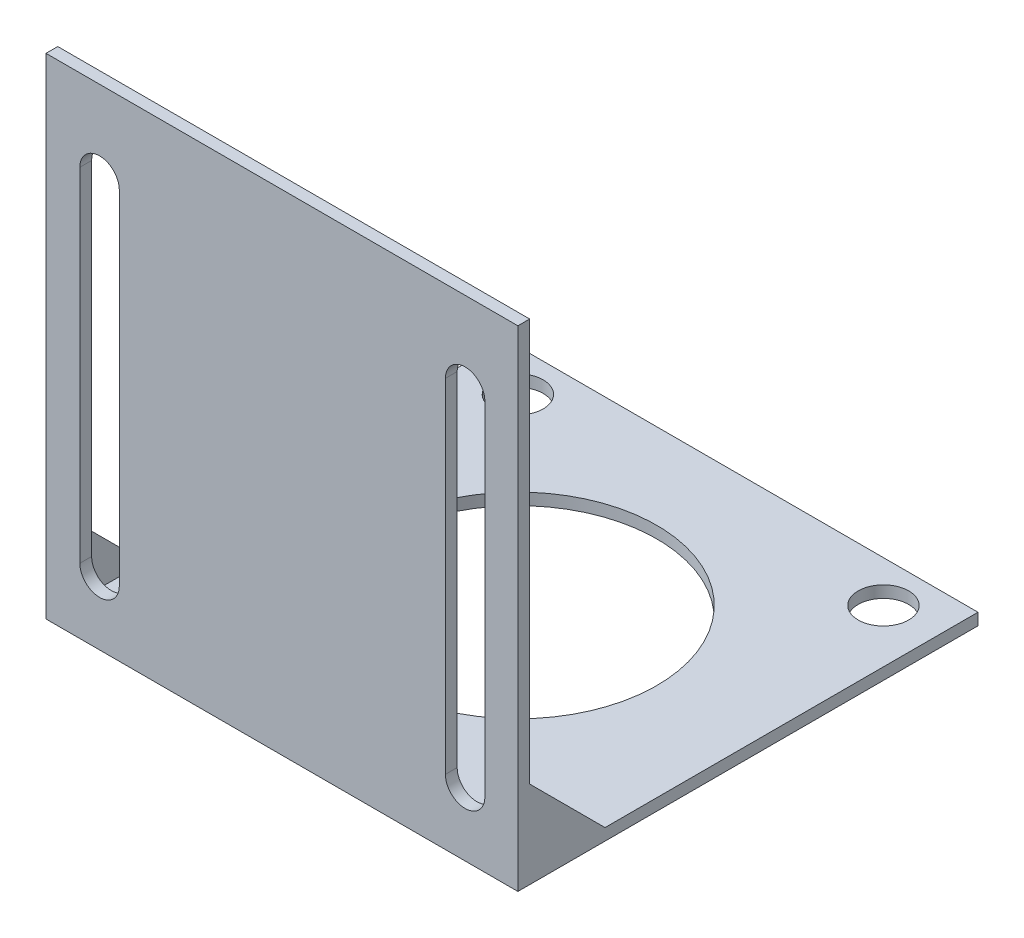
ISO-10303-21;
HEADER;
FILE_DESCRIPTION(('STEP AP214'),'2;1');
FILE_NAME('part.step','',(''),(''),'','','');
FILE_SCHEMA(('AUTOMOTIVE_DESIGN { 1 0 10303 214 1 1 1 1 }'));
ENDSEC;
DATA;
#1=APPLICATION_CONTEXT('core data for automotive mechanical design processes');
#2=APPLICATION_PROTOCOL_DEFINITION('international standard','automotive_design',2000,#1);
#3=PRODUCT_CONTEXT('',#1,'mechanical');
#4=PRODUCT('Part','Part','',(#3));
#5=PRODUCT_RELATED_PRODUCT_CATEGORY('part','',(#4));
#6=PRODUCT_DEFINITION_FORMATION('','',#4);
#7=PRODUCT_DEFINITION_CONTEXT('part definition',#1,'design');
#8=PRODUCT_DEFINITION('design','',#6,#7);
#9=PRODUCT_DEFINITION_SHAPE('','',#8);
#10=(LENGTH_UNIT() NAMED_UNIT(*) SI_UNIT(.MILLI.,.METRE.));
#11=(NAMED_UNIT(*) PLANE_ANGLE_UNIT() SI_UNIT($,.RADIAN.));
#12=(NAMED_UNIT(*) SI_UNIT($,.STERADIAN.) SOLID_ANGLE_UNIT());
#13=UNCERTAINTY_MEASURE_WITH_UNIT(LENGTH_MEASURE(1.E-05),#10,'distance_accuracy_value','');
#14=(GEOMETRIC_REPRESENTATION_CONTEXT(3) GLOBAL_UNCERTAINTY_ASSIGNED_CONTEXT((#13)) GLOBAL_UNIT_ASSIGNED_CONTEXT((#10,
#11,#12)) REPRESENTATION_CONTEXT('',''));
#15=CARTESIAN_POINT('',(0.,0.,0.));
#16=DIRECTION('',(0.,0.,1.));
#17=DIRECTION('',(1.,0.,0.));
#18=AXIS2_PLACEMENT_3D('',#15,#16,#17);
#19=CARTESIAN_POINT('',(0.,0.79375,0.));
#20=DIRECTION('',(0.,1.,0.));
#21=DIRECTION('',(0.,0.,1.));
#22=AXIS2_PLACEMENT_3D('',#19,#20,#21);
#23=PLANE('',#22);
#24=CARTESIAN_POINT('',(27.4280122,0.79375,27.4280122));
#25=DIRECTION('',(0.,1.,0.));
#26=DIRECTION('',(0.,0.,1.));
#27=AXIS2_PLACEMENT_3D('',#24,#25,#26);
#28=CIRCLE('',#27,1.70180000000003);
#29=CARTESIAN_POINT('',(27.4280122,0.79375,29.1298122));
#30=VERTEX_POINT('',#29);
#31=EDGE_CURVE('E359',#30,#30,#28,.T.);
#32=ORIENTED_EDGE('',*,*,#31,.F.);
#33=EDGE_LOOP('',(#32));
#34=FACE_BOUND('',#33,.T.);
#35=CARTESIAN_POINT('',(2.7900122,0.79375,2.7900122));
#36=DIRECTION('',(0.,1.,0.));
#37=DIRECTION('',(0.,0.,1.));
#38=AXIS2_PLACEMENT_3D('',#35,#36,#37);
#39=CIRCLE('',#38,1.70180000000003);
#40=CARTESIAN_POINT('',(2.7900122,0.79375,4.49181220000003));
#41=VERTEX_POINT('',#40);
#42=EDGE_CURVE('E375',#41,#41,#39,.T.);
#43=ORIENTED_EDGE('',*,*,#42,.F.);
#44=EDGE_LOOP('',(#43));
#45=FACE_BOUND('',#44,.T.);
#46=DIRECTION('',(-1.,0.,0.));
#47=VECTOR('',#46,1.);
#48=CARTESIAN_POINT('',(0.,0.79375,0.));
#49=LINE('',#48,#47);
#50=CARTESIAN_POINT('',(31.0117744,0.79375,0.));
#51=VERTEX_POINT('',#50);
#52=CARTESIAN_POINT('',(-0.79375,0.79375,0.));
#53=VERTEX_POINT('',#52);
#54=EDGE_CURVE('E11',#51,#53,#49,.T.);
#55=ORIENTED_EDGE('',*,*,#54,.T.);
#56=DIRECTION('',(0.,0.,-1.));
#57=VECTOR('',#56,1.);
#58=CARTESIAN_POINT('',(-0.79375,0.793749999999999,25.1380244000001));
#59=LINE('',#58,#57);
#60=CARTESIAN_POINT('',(-0.79375,0.793749999999999,25.1380244000001));
#61=VERTEX_POINT('',#60);
#62=EDGE_CURVE('E283',#61,#53,#59,.T.);
#63=ORIENTED_EDGE('',*,*,#62,.F.);
#64=DIRECTION('',(1.,0.,0.));
#65=VECTOR('',#64,1.);
#66=CARTESIAN_POINT('',(-0.79375,0.793749999999999,25.1380244000001));
#67=LINE('',#66,#65);
#68=CARTESIAN_POINT('',(0.,0.793749999999999,25.1380244000001));
#69=VERTEX_POINT('',#68);
#70=EDGE_CURVE('E287',#61,#69,#67,.T.);
#71=ORIENTED_EDGE('',*,*,#70,.T.);
#72=DIRECTION('',(0.,0.,1.));
#73=VECTOR('',#72,1.);
#74=CARTESIAN_POINT('',(0.,0.79375,0.));
#75=LINE('',#74,#73);
#76=CARTESIAN_POINT('',(0.,0.79375,30.2180244));
#77=VERTEX_POINT('',#76);
#78=EDGE_CURVE('E390',#69,#77,#75,.T.);
#79=ORIENTED_EDGE('',*,*,#78,.T.);
#80=DIRECTION('',(1.,0.,0.));
#81=VECTOR('',#80,1.);
#82=CARTESIAN_POINT('',(0.,0.79375,30.2180244));
#83=LINE('',#82,#81);
#84=CARTESIAN_POINT('',(30.2180244,0.79375,30.2180244));
#85=VERTEX_POINT('',#84);
#86=EDGE_CURVE('E394',#77,#85,#83,.T.);
#87=ORIENTED_EDGE('',*,*,#86,.T.);
#88=DIRECTION('',(0.,0.,-1.));
#89=VECTOR('',#88,1.);
#90=CARTESIAN_POINT('',(30.2180244,0.79375,0.));
#91=LINE('',#90,#89);
#92=CARTESIAN_POINT('',(30.2180244,0.793749999999998,25.1380244));
#93=VERTEX_POINT('',#92);
#94=EDGE_CURVE('E51',#85,#93,#91,.T.);
#95=ORIENTED_EDGE('',*,*,#94,.T.);
#96=DIRECTION('',(-1.,0.,0.));
#97=VECTOR('',#96,1.);
#98=CARTESIAN_POINT('',(31.0117744,0.793750000000001,25.1380244));
#99=LINE('',#98,#97);
#100=CARTESIAN_POINT('',(31.0117744,0.793750000000001,25.1380244));
#101=VERTEX_POINT('',#100);
#102=EDGE_CURVE('E331',#101,#93,#99,.T.);
#103=ORIENTED_EDGE('',*,*,#102,.F.);
#104=DIRECTION('',(0.,0.,1.));
#105=VECTOR('',#104,1.);
#106=CARTESIAN_POINT('',(31.0117744,0.79375,0.));
#107=LINE('',#106,#105);
#108=EDGE_CURVE('E310',#51,#101,#107,.T.);
#109=ORIENTED_EDGE('',*,*,#108,.F.);
#110=EDGE_LOOP('',(#55,#63,#71,#79,#87,#95,#103,#109));
#111=FACE_BOUND('',#110,.T.);
#112=CARTESIAN_POINT('',(15.1090122,0.79375,15.1090122));
#113=DIRECTION('',(0.,1.,0.));
#114=DIRECTION('',(0.,0.,1.));
#115=AXIS2_PLACEMENT_3D('',#112,#113,#114);
#116=CIRCLE('',#115,9.3599);
#117=CARTESIAN_POINT('',(15.1090122,0.79375,24.4689122));
#118=VERTEX_POINT('',#117);
#119=EDGE_CURVE('E383',#118,#118,#116,.T.);
#120=ORIENTED_EDGE('',*,*,#119,.F.);
#121=EDGE_LOOP('',(#120));
#122=FACE_BOUND('',#121,.T.);
#123=CARTESIAN_POINT('',(27.4280122,0.79375,2.7900122));
#124=DIRECTION('',(0.,1.,0.));
#125=DIRECTION('',(0.,0.,1.));
#126=AXIS2_PLACEMENT_3D('',#123,#124,#125);
#127=CIRCLE('',#126,1.70180000000003);
#128=CARTESIAN_POINT('',(27.4280122,0.79375,4.49181220000003));
#129=VERTEX_POINT('',#128);
#130=EDGE_CURVE('E367',#129,#129,#127,.T.);
#131=ORIENTED_EDGE('',*,*,#130,.F.);
#132=EDGE_LOOP('',(#131));
#133=FACE_BOUND('',#132,.T.);
#134=CARTESIAN_POINT('',(2.7900122,0.79375,27.4280122));
#135=DIRECTION('',(0.,1.,0.));
#136=DIRECTION('',(0.,0.,1.));
#137=AXIS2_PLACEMENT_3D('',#134,#135,#136);
#138=CIRCLE('',#137,1.70180000000003);
#139=CARTESIAN_POINT('',(2.7900122,0.79375,29.1298122));
#140=VERTEX_POINT('',#139);
#141=EDGE_CURVE('E351',#140,#140,#138,.T.);
#142=ORIENTED_EDGE('',*,*,#141,.F.);
#143=EDGE_LOOP('',(#142));
#144=FACE_BOUND('',#143,.T.);
#145=ADVANCED_FACE('F41',(#34,#45,#111,#122,#133,#144),#23,.T.);
#146=CARTESIAN_POINT('',(0.,0.,0.));
#147=DIRECTION('',(0.,1.,0.));
#148=DIRECTION('',(0.,0.,1.));
#149=AXIS2_PLACEMENT_3D('',#146,#147,#148);
#150=PLANE('',#149);
#151=DIRECTION('',(1.,0.,0.));
#152=VECTOR('',#151,1.);
#153=CARTESIAN_POINT('',(0.,0.,31.0117744));
#154=LINE('',#153,#152);
#155=CARTESIAN_POINT('',(-0.79375,0.,31.0117744));
#156=VERTEX_POINT('',#155);
#157=CARTESIAN_POINT('',(31.0117744,0.,31.0117744));
#158=VERTEX_POINT('',#157);
#159=EDGE_CURVE('E336',#156,#158,#154,.T.);
#160=ORIENTED_EDGE('',*,*,#159,.F.);
#161=DIRECTION('',(0.,0.,1.));
#162=VECTOR('',#161,1.);
#163=CARTESIAN_POINT('',(-0.79375,0.,0.));
#164=LINE('',#163,#162);
#165=CARTESIAN_POINT('',(-0.79375,0.,0.));
#166=VERTEX_POINT('',#165);
#167=EDGE_CURVE('E265',#166,#156,#164,.T.);
#168=ORIENTED_EDGE('',*,*,#167,.F.);
#169=DIRECTION('',(-1.,0.,0.));
#170=VECTOR('',#169,1.);
#171=CARTESIAN_POINT('',(0.,0.,0.));
#172=LINE('',#171,#170);
#173=CARTESIAN_POINT('',(31.0117744,0.,0.));
#174=VERTEX_POINT('',#173);
#175=EDGE_CURVE('E45',#174,#166,#172,.T.);
#176=ORIENTED_EDGE('',*,*,#175,.F.);
#177=DIRECTION('',(0.,0.,-1.));
#178=VECTOR('',#177,1.);
#179=CARTESIAN_POINT('',(31.0117744,0.,31.0117744));
#180=LINE('',#179,#178);
#181=EDGE_CURVE('E302',#158,#174,#180,.T.);
#182=ORIENTED_EDGE('',*,*,#181,.F.);
#183=EDGE_LOOP('',(#160,#168,#176,#182));
#184=FACE_BOUND('',#183,.T.);
#185=CARTESIAN_POINT('',(15.1090122,0.,15.1090122));
#186=DIRECTION('',(0.,1.,0.));
#187=DIRECTION('',(0.,0.,1.));
#188=AXIS2_PLACEMENT_3D('',#185,#186,#187);
#189=CIRCLE('',#188,9.3599);
#190=CARTESIAN_POINT('',(15.1090122,0.,24.4689122));
#191=VERTEX_POINT('',#190);
#192=EDGE_CURVE('E379',#191,#191,#189,.T.);
#193=ORIENTED_EDGE('',*,*,#192,.T.);
#194=EDGE_LOOP('',(#193));
#195=FACE_BOUND('',#194,.T.);
#196=CARTESIAN_POINT('',(2.7900122,0.,2.7900122));
#197=DIRECTION('',(0.,1.,0.));
#198=DIRECTION('',(0.,0.,1.));
#199=AXIS2_PLACEMENT_3D('',#196,#197,#198);
#200=CIRCLE('',#199,1.70180000000003);
#201=CARTESIAN_POINT('',(2.7900122,0.,4.49181220000003));
#202=VERTEX_POINT('',#201);
#203=EDGE_CURVE('E371',#202,#202,#200,.T.);
#204=ORIENTED_EDGE('',*,*,#203,.T.);
#205=EDGE_LOOP('',(#204));
#206=FACE_BOUND('',#205,.T.);
#207=CARTESIAN_POINT('',(27.4280122,0.,2.7900122));
#208=DIRECTION('',(0.,1.,0.));
#209=DIRECTION('',(0.,0.,1.));
#210=AXIS2_PLACEMENT_3D('',#207,#208,#209);
#211=CIRCLE('',#210,1.70180000000003);
#212=CARTESIAN_POINT('',(27.4280122,0.,4.49181220000003));
#213=VERTEX_POINT('',#212);
#214=EDGE_CURVE('E363',#213,#213,#211,.T.);
#215=ORIENTED_EDGE('',*,*,#214,.T.);
#216=EDGE_LOOP('',(#215));
#217=FACE_BOUND('',#216,.T.);
#218=CARTESIAN_POINT('',(27.4280122,0.,27.4280122));
#219=DIRECTION('',(0.,1.,0.));
#220=DIRECTION('',(0.,0.,1.));
#221=AXIS2_PLACEMENT_3D('',#218,#219,#220);
#222=CIRCLE('',#221,1.70180000000003);
#223=CARTESIAN_POINT('',(27.4280122,0.,29.1298122));
#224=VERTEX_POINT('',#223);
#225=EDGE_CURVE('E355',#224,#224,#222,.T.);
#226=ORIENTED_EDGE('',*,*,#225,.T.);
#227=EDGE_LOOP('',(#226));
#228=FACE_BOUND('',#227,.T.);
#229=CARTESIAN_POINT('',(2.7900122,0.,27.4280122));
#230=DIRECTION('',(0.,1.,0.));
#231=DIRECTION('',(0.,0.,1.));
#232=AXIS2_PLACEMENT_3D('',#229,#230,#231);
#233=CIRCLE('',#232,1.70180000000003);
#234=CARTESIAN_POINT('',(2.7900122,0.,29.1298122));
#235=VERTEX_POINT('',#234);
#236=EDGE_CURVE('E343',#235,#235,#233,.T.);
#237=ORIENTED_EDGE('',*,*,#236,.T.);
#238=EDGE_LOOP('',(#237));
#239=FACE_BOUND('',#238,.T.);
#240=ADVANCED_FACE('F431',(#184,#195,#206,#217,#228,#239),#150,.F.);
#241=CARTESIAN_POINT('',(0.,0.79375,0.));
#242=DIRECTION('',(0.,0.,1.));
#243=DIRECTION('',(1.,0.,0.));
#244=AXIS2_PLACEMENT_3D('',#241,#242,#243);
#245=PLANE('',#244);
#246=ORIENTED_EDGE('',*,*,#175,.T.);
#247=DIRECTION('',(0.,-1.,0.));
#248=VECTOR('',#247,1.);
#249=CARTESIAN_POINT('',(-0.79375,0.79375,0.));
#250=LINE('',#249,#248);
#251=EDGE_CURVE('E261',#53,#166,#250,.T.);
#252=ORIENTED_EDGE('',*,*,#251,.F.);
#253=ORIENTED_EDGE('',*,*,#54,.F.);
#254=DIRECTION('',(0.,1.,0.));
#255=VECTOR('',#254,1.);
#256=CARTESIAN_POINT('',(31.0117744,0.,0.));
#257=LINE('',#256,#255);
#258=EDGE_CURVE('E306',#174,#51,#257,.T.);
#259=ORIENTED_EDGE('',*,*,#258,.F.);
#260=EDGE_LOOP('',(#246,#252,#253,#259));
#261=FACE_BOUND('',#260,.T.);
#262=ADVANCED_FACE('F43',(#261),#245,.F.);
#263=CARTESIAN_POINT('',(15.1090122,0.79375,15.1090122));
#264=DIRECTION('',(0.,-1.,0.));
#265=DIRECTION('',(0.,0.,-1.));
#266=AXIS2_PLACEMENT_3D('',#263,#264,#265);
#267=CYLINDRICAL_SURFACE('',#266,9.3599);
#268=ORIENTED_EDGE('',*,*,#119,.T.);
#269=EDGE_LOOP('',(#268));
#270=FACE_BOUND('',#269,.T.);
#271=ORIENTED_EDGE('',*,*,#192,.F.);
#272=EDGE_LOOP('',(#271));
#273=FACE_BOUND('',#272,.T.);
#274=ADVANCED_FACE('F463',(#270,#273),#267,.F.);
#275=CARTESIAN_POINT('',(2.7900122,0.79375,2.7900122));
#276=DIRECTION('',(0.,-1.,0.));
#277=DIRECTION('',(0.,0.,-1.));
#278=AXIS2_PLACEMENT_3D('',#275,#276,#277);
#279=CYLINDRICAL_SURFACE('',#278,1.70180000000003);
#280=ORIENTED_EDGE('',*,*,#42,.T.);
#281=EDGE_LOOP('',(#280));
#282=FACE_BOUND('',#281,.T.);
#283=ORIENTED_EDGE('',*,*,#203,.F.);
#284=EDGE_LOOP('',(#283));
#285=FACE_BOUND('',#284,.T.);
#286=ADVANCED_FACE('F466',(#282,#285),#279,.F.);
#287=CARTESIAN_POINT('',(27.4280122,0.79375,2.7900122));
#288=DIRECTION('',(0.,-1.,0.));
#289=DIRECTION('',(0.,0.,-1.));
#290=AXIS2_PLACEMENT_3D('',#287,#288,#289);
#291=CYLINDRICAL_SURFACE('',#290,1.70180000000003);
#292=ORIENTED_EDGE('',*,*,#130,.T.);
#293=EDGE_LOOP('',(#292));
#294=FACE_BOUND('',#293,.T.);
#295=ORIENTED_EDGE('',*,*,#214,.F.);
#296=EDGE_LOOP('',(#295));
#297=FACE_BOUND('',#296,.T.);
#298=ADVANCED_FACE('F470',(#294,#297),#291,.F.);
#299=CARTESIAN_POINT('',(27.4280122,0.79375,27.4280122));
#300=DIRECTION('',(0.,-1.,0.));
#301=DIRECTION('',(0.,0.,-1.));
#302=AXIS2_PLACEMENT_3D('',#299,#300,#301);
#303=CYLINDRICAL_SURFACE('',#302,1.70180000000003);
#304=ORIENTED_EDGE('',*,*,#31,.T.);
#305=EDGE_LOOP('',(#304));
#306=FACE_BOUND('',#305,.T.);
#307=ORIENTED_EDGE('',*,*,#225,.F.);
#308=EDGE_LOOP('',(#307));
#309=FACE_BOUND('',#308,.T.);
#310=ADVANCED_FACE('F474',(#306,#309),#303,.F.);
#311=CARTESIAN_POINT('',(2.7900122,0.79375,27.4280122));
#312=DIRECTION('',(0.,-1.,0.));
#313=DIRECTION('',(0.,0.,-1.));
#314=AXIS2_PLACEMENT_3D('',#311,#312,#313);
#315=CYLINDRICAL_SURFACE('',#314,1.70180000000003);
#316=ORIENTED_EDGE('',*,*,#141,.T.);
#317=EDGE_LOOP('',(#316));
#318=FACE_BOUND('',#317,.T.);
#319=ORIENTED_EDGE('',*,*,#236,.F.);
#320=EDGE_LOOP('',(#319));
#321=FACE_BOUND('',#320,.T.);
#322=ADVANCED_FACE('F478',(#318,#321),#315,.F.);
#323=CARTESIAN_POINT('',(0.,0.,30.2180244));
#324=DIRECTION('',(0.,0.,-1.));
#325=DIRECTION('',(-1.,0.,0.));
#326=AXIS2_PLACEMENT_3D('',#323,#324,#325);
#327=PLANE('',#326);
#328=CARTESIAN_POINT('',(2.8177744,4.39552851412373,30.2180244));
#329=DIRECTION('',(0.,0.,-1.));
#330=DIRECTION('',(-1.,0.,0.));
#331=AXIS2_PLACEMENT_3D('',#328,#329,#330);
#332=CIRCLE('',#331,1.32949536095248);
#333=CARTESIAN_POINT('',(4.14726976095248,4.39552851412373,30.2180244));
#334=VERTEX_POINT('',#333);
#335=CARTESIAN_POINT('',(1.48827903904752,4.39552851412373,30.2180244));
#336=VERTEX_POINT('',#335);
#337=EDGE_CURVE('E58',#334,#336,#332,.T.);
#338=ORIENTED_EDGE('',*,*,#337,.F.);
#339=DIRECTION('',(0.,-1.,0.));
#340=VECTOR('',#339,1.);
#341=CARTESIAN_POINT('',(4.14726976095248,4.39552851412373,30.2180244));
#342=LINE('',#341,#340);
#343=CARTESIAN_POINT('',(4.14726976095248,27.5098300987224,30.2180244));
#344=VERTEX_POINT('',#343);
#345=EDGE_CURVE('E191',#344,#334,#342,.T.);
#346=ORIENTED_EDGE('',*,*,#345,.F.);
#347=CARTESIAN_POINT('',(2.8177744,27.5098300987224,30.2180244));
#348=DIRECTION('',(0.,0.,-1.));
#349=DIRECTION('',(-1.,0.,0.));
#350=AXIS2_PLACEMENT_3D('',#347,#348,#349);
#351=CIRCLE('',#350,1.32949536095248);
#352=CARTESIAN_POINT('',(1.48827903904752,27.5098300987224,30.2180244));
#353=VERTEX_POINT('',#352);
#354=EDGE_CURVE('E195',#353,#344,#351,.T.);
#355=ORIENTED_EDGE('',*,*,#354,.F.);
#356=DIRECTION('',(0.,1.,0.));
#357=VECTOR('',#356,1.);
#358=CARTESIAN_POINT('',(1.48827903904752,4.39552851412373,30.2180244));
#359=LINE('',#358,#357);
#360=EDGE_CURVE('E204',#336,#353,#359,.T.);
#361=ORIENTED_EDGE('',*,*,#360,.F.);
#362=EDGE_LOOP('',(#338,#346,#355,#361));
#363=FACE_BOUND('',#362,.T.);
#364=CARTESIAN_POINT('',(27.4557744,4.39552851412373,30.2180244));
#365=DIRECTION('',(0.,0.,-1.));
#366=DIRECTION('',(-1.,0.,0.));
#367=AXIS2_PLACEMENT_3D('',#364,#365,#366);
#368=CIRCLE('',#367,1.32949536095248);
#369=CARTESIAN_POINT('',(28.7852697609525,4.39552851412373,30.2180244));
#370=VERTEX_POINT('',#369);
#371=CARTESIAN_POINT('',(26.1262790390475,4.39552851412373,30.2180244));
#372=VERTEX_POINT('',#371);
#373=EDGE_CURVE('E66',#370,#372,#368,.T.);
#374=ORIENTED_EDGE('',*,*,#373,.F.);
#375=DIRECTION('',(0.,-1.,0.));
#376=VECTOR('',#375,1.);
#377=CARTESIAN_POINT('',(28.7852697609525,4.39552851412373,30.2180244));
#378=LINE('',#377,#376);
#379=CARTESIAN_POINT('',(28.7852697609525,27.5098300987224,30.2180244));
#380=VERTEX_POINT('',#379);
#381=EDGE_CURVE('E225',#380,#370,#378,.T.);
#382=ORIENTED_EDGE('',*,*,#381,.F.);
#383=CARTESIAN_POINT('',(27.4557744,27.5098300987224,30.2180244));
#384=DIRECTION('',(0.,0.,-1.));
#385=DIRECTION('',(-1.,0.,0.));
#386=AXIS2_PLACEMENT_3D('',#383,#384,#385);
#387=CIRCLE('',#386,1.32949536095248);
#388=CARTESIAN_POINT('',(26.1262790390475,27.5098300987224,30.2180244));
#389=VERTEX_POINT('',#388);
#390=EDGE_CURVE('E244',#389,#380,#387,.T.);
#391=ORIENTED_EDGE('',*,*,#390,.F.);
#392=DIRECTION('',(0.,1.,0.));
#393=VECTOR('',#392,1.);
#394=CARTESIAN_POINT('',(26.1262790390475,4.39552851412373,30.2180244));
#395=LINE('',#394,#393);
#396=EDGE_CURVE('E240',#372,#389,#395,.T.);
#397=ORIENTED_EDGE('',*,*,#396,.F.);
#398=EDGE_LOOP('',(#374,#382,#391,#397));
#399=FACE_BOUND('',#398,.T.);
#400=ORIENTED_EDGE('',*,*,#86,.F.);
#401=DIRECTION('',(0.,-1.,0.));
#402=VECTOR('',#401,1.);
#403=CARTESIAN_POINT('',(0.,0.,30.2180244));
#404=LINE('',#403,#402);
#405=CARTESIAN_POINT('',(0.,5.87375,30.2180244));
#406=VERTEX_POINT('',#405);
#407=EDGE_CURVE('E335',#406,#77,#404,.T.);
#408=ORIENTED_EDGE('',*,*,#407,.F.);
#409=DIRECTION('',(1.,0.,0.));
#410=VECTOR('',#409,1.);
#411=CARTESIAN_POINT('',(-0.79375,5.87375,30.2180244));
#412=LINE('',#411,#410);
#413=CARTESIAN_POINT('',(-0.79375,5.87375,30.2180244));
#414=VERTEX_POINT('',#413);
#415=EDGE_CURVE('E294',#414,#406,#412,.T.);
#416=ORIENTED_EDGE('',*,*,#415,.F.);
#417=DIRECTION('',(0.,-1.,0.));
#418=VECTOR('',#417,1.);
#419=CARTESIAN_POINT('',(-0.79375,33.02,30.2180244));
#420=LINE('',#419,#418);
#421=CARTESIAN_POINT('',(-0.79375,33.02,30.2180244));
#422=VERTEX_POINT('',#421);
#423=EDGE_CURVE('E277',#422,#414,#420,.T.);
#424=ORIENTED_EDGE('',*,*,#423,.F.);
#425=DIRECTION('',(-1.,0.,0.));
#426=VECTOR('',#425,1.);
#427=CARTESIAN_POINT('',(0.,33.02,30.2180244));
#428=LINE('',#427,#426);
#429=CARTESIAN_POINT('',(31.0117744,33.02,30.2180244));
#430=VERTEX_POINT('',#429);
#431=EDGE_CURVE('E340',#430,#422,#428,.T.);
#432=ORIENTED_EDGE('',*,*,#431,.F.);
#433=DIRECTION('',(0.,1.,0.));
#434=VECTOR('',#433,1.);
#435=CARTESIAN_POINT('',(31.0117744,5.87375,30.2180244));
#436=LINE('',#435,#434);
#437=CARTESIAN_POINT('',(31.0117744,5.87375,30.2180244));
#438=VERTEX_POINT('',#437);
#439=EDGE_CURVE('E316',#438,#430,#436,.T.);
#440=ORIENTED_EDGE('',*,*,#439,.F.);
#441=DIRECTION('',(-1.,0.,0.));
#442=VECTOR('',#441,1.);
#443=CARTESIAN_POINT('',(31.0117744,5.87375,30.2180244));
#444=LINE('',#443,#442);
#445=CARTESIAN_POINT('',(30.2180244,5.87375,30.2180244));
#446=VERTEX_POINT('',#445);
#447=EDGE_CURVE('E324',#438,#446,#444,.T.);
#448=ORIENTED_EDGE('',*,*,#447,.T.);
#449=DIRECTION('',(0.,1.,0.));
#450=VECTOR('',#449,1.);
#451=CARTESIAN_POINT('',(30.2180244,0.,30.2180244));
#452=LINE('',#451,#450);
#453=EDGE_CURVE('E346',#85,#446,#452,.T.);
#454=ORIENTED_EDGE('',*,*,#453,.F.);
#455=EDGE_LOOP('',(#400,#408,#416,#424,#432,#440,#448,#454));
#456=FACE_BOUND('',#455,.T.);
#457=ADVANCED_FACE('F413',(#363,#399,#456),#327,.T.);
#458=CARTESIAN_POINT('',(0.,33.02,31.0117744));
#459=DIRECTION('',(0.,-1.,0.));
#460=DIRECTION('',(0.,0.,-1.));
#461=AXIS2_PLACEMENT_3D('',#458,#459,#460);
#462=PLANE('',#461);
#463=ORIENTED_EDGE('',*,*,#431,.T.);
#464=DIRECTION('',(0.,0.,-1.));
#465=VECTOR('',#464,1.);
#466=CARTESIAN_POINT('',(-0.79375,33.02,31.0117744));
#467=LINE('',#466,#465);
#468=CARTESIAN_POINT('',(-0.79375,33.02,31.0117744));
#469=VERTEX_POINT('',#468);
#470=EDGE_CURVE('E273',#469,#422,#467,.T.);
#471=ORIENTED_EDGE('',*,*,#470,.F.);
#472=DIRECTION('',(-1.,0.,0.));
#473=VECTOR('',#472,1.);
#474=CARTESIAN_POINT('',(0.,33.02,31.0117744));
#475=LINE('',#474,#473);
#476=CARTESIAN_POINT('',(31.0117744,33.02,31.0117744));
#477=VERTEX_POINT('',#476);
#478=EDGE_CURVE('E339',#477,#469,#475,.T.);
#479=ORIENTED_EDGE('',*,*,#478,.F.);
#480=DIRECTION('',(0.,0.,1.));
#481=VECTOR('',#480,1.);
#482=CARTESIAN_POINT('',(31.0117744,33.02,30.2180244));
#483=LINE('',#482,#481);
#484=EDGE_CURVE('E320',#430,#477,#483,.T.);
#485=ORIENTED_EDGE('',*,*,#484,.F.);
#486=EDGE_LOOP('',(#463,#471,#479,#485));
#487=FACE_BOUND('',#486,.T.);
#488=ADVANCED_FACE('F422',(#487),#462,.F.);
#489=CARTESIAN_POINT('',(0.,0.,31.0117744));
#490=DIRECTION('',(0.,0.,-1.));
#491=DIRECTION('',(-1.,0.,0.));
#492=AXIS2_PLACEMENT_3D('',#489,#490,#491);
#493=PLANE('',#492);
#494=DIRECTION('',(0.,-1.,0.));
#495=VECTOR('',#494,1.);
#496=CARTESIAN_POINT('',(4.14726976095248,4.39552851412373,31.0117744));
#497=LINE('',#496,#495);
#498=CARTESIAN_POINT('',(4.14726976095248,27.5098300987224,31.0117744));
#499=VERTEX_POINT('',#498);
#500=CARTESIAN_POINT('',(4.14726976095248,4.39552851412373,31.0117744));
#501=VERTEX_POINT('',#500);
#502=EDGE_CURVE('E176',#499,#501,#497,.T.);
#503=ORIENTED_EDGE('',*,*,#502,.T.);
#504=CARTESIAN_POINT('',(2.8177744,4.39552851412373,31.0117744));
#505=DIRECTION('',(0.,0.,-1.));
#506=DIRECTION('',(-1.,0.,0.));
#507=AXIS2_PLACEMENT_3D('',#504,#505,#506);
#508=CIRCLE('',#507,1.32949536095248);
#509=CARTESIAN_POINT('',(1.48827903904752,4.39552851412373,31.0117744));
#510=VERTEX_POINT('',#509);
#511=EDGE_CURVE('E169',#501,#510,#508,.T.);
#512=ORIENTED_EDGE('',*,*,#511,.T.);
#513=DIRECTION('',(0.,1.,0.));
#514=VECTOR('',#513,1.);
#515=CARTESIAN_POINT('',(1.48827903904752,4.39552851412373,31.0117744));
#516=LINE('',#515,#514);
#517=CARTESIAN_POINT('',(1.48827903904752,27.5098300987224,31.0117744));
#518=VERTEX_POINT('',#517);
#519=EDGE_CURVE('E180',#510,#518,#516,.T.);
#520=ORIENTED_EDGE('',*,*,#519,.T.);
#521=CARTESIAN_POINT('',(2.8177744,27.5098300987224,31.0117744));
#522=DIRECTION('',(0.,0.,-1.));
#523=DIRECTION('',(-1.,0.,0.));
#524=AXIS2_PLACEMENT_3D('',#521,#522,#523);
#525=CIRCLE('',#524,1.32949536095248);
#526=EDGE_CURVE('E185',#518,#499,#525,.T.);
#527=ORIENTED_EDGE('',*,*,#526,.T.);
#528=EDGE_LOOP('',(#503,#512,#520,#527));
#529=FACE_BOUND('',#528,.T.);
#530=DIRECTION('',(0.,-1.,0.));
#531=VECTOR('',#530,1.);
#532=CARTESIAN_POINT('',(28.7852697609525,4.39552851412373,31.0117744));
#533=LINE('',#532,#531);
#534=CARTESIAN_POINT('',(28.7852697609525,27.5098300987224,31.0117744));
#535=VERTEX_POINT('',#534);
#536=CARTESIAN_POINT('',(28.7852697609525,4.39552851412373,31.0117744));
#537=VERTEX_POINT('',#536);
#538=EDGE_CURVE('E233',#535,#537,#533,.T.);
#539=ORIENTED_EDGE('',*,*,#538,.T.);
#540=CARTESIAN_POINT('',(27.4557744,4.39552851412373,31.0117744));
#541=DIRECTION('',(0.,0.,-1.));
#542=DIRECTION('',(-1.,0.,0.));
#543=AXIS2_PLACEMENT_3D('',#540,#541,#542);
#544=CIRCLE('',#543,1.32949536095248);
#545=CARTESIAN_POINT('',(26.1262790390475,4.39552851412373,31.0117744));
#546=VERTEX_POINT('',#545);
#547=EDGE_CURVE('E220',#537,#546,#544,.T.);
#548=ORIENTED_EDGE('',*,*,#547,.T.);
#549=DIRECTION('',(0.,1.,0.));
#550=VECTOR('',#549,1.);
#551=CARTESIAN_POINT('',(26.1262790390475,4.39552851412373,31.0117744));
#552=LINE('',#551,#550);
#553=CARTESIAN_POINT('',(26.1262790390475,27.5098300987224,31.0117744));
#554=VERTEX_POINT('',#553);
#555=EDGE_CURVE('E224',#546,#554,#552,.T.);
#556=ORIENTED_EDGE('',*,*,#555,.T.);
#557=CARTESIAN_POINT('',(27.4557744,27.5098300987224,31.0117744));
#558=DIRECTION('',(0.,0.,-1.));
#559=DIRECTION('',(-1.,0.,0.));
#560=AXIS2_PLACEMENT_3D('',#557,#558,#559);
#561=CIRCLE('',#560,1.32949536095248);
#562=EDGE_CURVE('E229',#554,#535,#561,.T.);
#563=ORIENTED_EDGE('',*,*,#562,.T.);
#564=EDGE_LOOP('',(#539,#548,#556,#563));
#565=FACE_BOUND('',#564,.T.);
#566=ORIENTED_EDGE('',*,*,#478,.T.);
#567=DIRECTION('',(0.,1.,0.));
#568=VECTOR('',#567,1.);
#569=CARTESIAN_POINT('',(-0.79375,0.,31.0117744));
#570=LINE('',#569,#568);
#571=EDGE_CURVE('E269',#156,#469,#570,.T.);
#572=ORIENTED_EDGE('',*,*,#571,.F.);
#573=ORIENTED_EDGE('',*,*,#159,.T.);
#574=DIRECTION('',(0.,-1.,0.));
#575=VECTOR('',#574,1.);
#576=CARTESIAN_POINT('',(31.0117744,33.02,31.0117744));
#577=LINE('',#576,#575);
#578=EDGE_CURVE('E298',#477,#158,#577,.T.);
#579=ORIENTED_EDGE('',*,*,#578,.F.);
#580=EDGE_LOOP('',(#566,#572,#573,#579));
#581=FACE_BOUND('',#580,.T.);
#582=ADVANCED_FACE('F187',(#529,#565,#581),#493,.F.);
#583=CARTESIAN_POINT('',(31.0117744,0.793750000000001,25.1380244));
#584=DIRECTION('',(0.,-0.707106781186549,0.707106781186546));
#585=DIRECTION('',(0.,-0.707106781186546,-0.707106781186549));
#586=AXIS2_PLACEMENT_3D('',#583,#584,#585);
#587=PLANE('',#586);
#588=DIRECTION('',(0.,0.707106781186546,0.707106781186549));
#589=VECTOR('',#588,1.);
#590=CARTESIAN_POINT('',(30.2180244,0.793750000000001,25.1380244));
#591=LINE('',#590,#589);
#592=EDGE_CURVE('E297',#93,#446,#591,.T.);
#593=ORIENTED_EDGE('',*,*,#592,.T.);
#594=ORIENTED_EDGE('',*,*,#447,.F.);
#595=DIRECTION('',(0.,0.707106781186546,0.707106781186549));
#596=VECTOR('',#595,1.);
#597=CARTESIAN_POINT('',(31.0117744,0.793750000000001,25.1380244));
#598=LINE('',#597,#596);
#599=EDGE_CURVE('E313',#101,#438,#598,.T.);
#600=ORIENTED_EDGE('',*,*,#599,.F.);
#601=ORIENTED_EDGE('',*,*,#102,.T.);
#602=EDGE_LOOP('',(#593,#594,#600,#601));
#603=FACE_BOUND('',#602,.T.);
#604=ADVANCED_FACE('F409',(#603),#587,.F.);
#605=CARTESIAN_POINT('',(31.0117744,0.,0.));
#606=DIRECTION('',(1.,0.,0.));
#607=DIRECTION('',(0.,0.,-1.));
#608=AXIS2_PLACEMENT_3D('',#605,#606,#607);
#609=PLANE('',#608);
#610=ORIENTED_EDGE('',*,*,#578,.T.);
#611=ORIENTED_EDGE('',*,*,#181,.T.);
#612=ORIENTED_EDGE('',*,*,#258,.T.);
#613=ORIENTED_EDGE('',*,*,#108,.T.);
#614=ORIENTED_EDGE('',*,*,#599,.T.);
#615=ORIENTED_EDGE('',*,*,#439,.T.);
#616=ORIENTED_EDGE('',*,*,#484,.T.);
#617=EDGE_LOOP('',(#610,#611,#612,#613,#614,#615,#616));
#618=FACE_BOUND('',#617,.T.);
#619=ADVANCED_FACE('F419',(#618),#609,.T.);
#620=CARTESIAN_POINT('',(30.2180244,0.,0.));
#621=DIRECTION('',(1.,0.,0.));
#622=DIRECTION('',(0.,0.,-1.));
#623=AXIS2_PLACEMENT_3D('',#620,#621,#622);
#624=PLANE('',#623);
#625=ORIENTED_EDGE('',*,*,#94,.F.);
#626=ORIENTED_EDGE('',*,*,#453,.T.);
#627=ORIENTED_EDGE('',*,*,#592,.F.);
#628=EDGE_LOOP('',(#625,#626,#627));
#629=FACE_BOUND('',#628,.T.);
#630=ADVANCED_FACE('F411',(#629),#624,.F.);
#631=CARTESIAN_POINT('',(0.,0.,0.));
#632=DIRECTION('',(-1.,0.,0.));
#633=DIRECTION('',(0.,0.,1.));
#634=AXIS2_PLACEMENT_3D('',#631,#632,#633);
#635=PLANE('',#634);
#636=DIRECTION('',(0.,-0.707106781186552,-0.707106781186543));
#637=VECTOR('',#636,1.);
#638=CARTESIAN_POINT('',(0.,0.793749999999999,25.1380244000001));
#639=LINE('',#638,#637);
#640=EDGE_CURVE('E214',#406,#69,#639,.T.);
#641=ORIENTED_EDGE('',*,*,#640,.F.);
#642=ORIENTED_EDGE('',*,*,#407,.T.);
#643=ORIENTED_EDGE('',*,*,#78,.F.);
#644=EDGE_LOOP('',(#641,#642,#643));
#645=FACE_BOUND('',#644,.T.);
#646=ADVANCED_FACE('F444',(#645),#635,.F.);
#647=CARTESIAN_POINT('',(-0.79375,0.793749999999999,25.1380244000001));
#648=DIRECTION('',(0.,-0.707106781186543,0.707106781186552));
#649=DIRECTION('',(0.,-0.707106781186552,-0.707106781186543));
#650=AXIS2_PLACEMENT_3D('',#647,#648,#649);
#651=PLANE('',#650);
#652=ORIENTED_EDGE('',*,*,#640,.T.);
#653=ORIENTED_EDGE('',*,*,#70,.F.);
#654=DIRECTION('',(0.,-0.707106781186552,-0.707106781186543));
#655=VECTOR('',#654,1.);
#656=CARTESIAN_POINT('',(-0.79375,0.793749999999999,25.1380244000001));
#657=LINE('',#656,#655);
#658=EDGE_CURVE('E280',#414,#61,#657,.T.);
#659=ORIENTED_EDGE('',*,*,#658,.F.);
#660=ORIENTED_EDGE('',*,*,#415,.T.);
#661=EDGE_LOOP('',(#652,#653,#659,#660));
#662=FACE_BOUND('',#661,.T.);
#663=ADVANCED_FACE('F441',(#662),#651,.F.);
#664=CARTESIAN_POINT('',(-0.79375,0.,0.));
#665=DIRECTION('',(-1.,0.,0.));
#666=DIRECTION('',(0.,0.,1.));
#667=AXIS2_PLACEMENT_3D('',#664,#665,#666);
#668=PLANE('',#667);
#669=ORIENTED_EDGE('',*,*,#251,.T.);
#670=ORIENTED_EDGE('',*,*,#167,.T.);
#671=ORIENTED_EDGE('',*,*,#571,.T.);
#672=ORIENTED_EDGE('',*,*,#470,.T.);
#673=ORIENTED_EDGE('',*,*,#423,.T.);
#674=ORIENTED_EDGE('',*,*,#658,.T.);
#675=ORIENTED_EDGE('',*,*,#62,.T.);
#676=EDGE_LOOP('',(#669,#670,#671,#672,#673,#674,#675));
#677=FACE_BOUND('',#676,.T.);
#678=ADVANCED_FACE('F427',(#677),#668,.T.);
#679=CARTESIAN_POINT('',(27.4557744,4.39552851412373,31.0117744));
#680=DIRECTION('',(0.,0.,-1.));
#681=DIRECTION('',(-1.,0.,0.));
#682=AXIS2_PLACEMENT_3D('',#679,#680,#681);
#683=CYLINDRICAL_SURFACE('',#682,1.32949536095248);
#684=ORIENTED_EDGE('',*,*,#373,.T.);
#685=DIRECTION('',(0.,0.,-1.));
#686=VECTOR('',#685,1.);
#687=CARTESIAN_POINT('',(26.1262790390475,4.39552851412373,31.0117744));
#688=LINE('',#687,#686);
#689=EDGE_CURVE('E237',#546,#372,#688,.T.);
#690=ORIENTED_EDGE('',*,*,#689,.F.);
#691=ORIENTED_EDGE('',*,*,#547,.F.);
#692=DIRECTION('',(0.,0.,-1.));
#693=VECTOR('',#692,1.);
#694=CARTESIAN_POINT('',(28.7852697609525,4.39552851412373,31.0117744));
#695=LINE('',#694,#693);
#696=EDGE_CURVE('E205',#537,#370,#695,.T.);
#697=ORIENTED_EDGE('',*,*,#696,.T.);
#698=EDGE_LOOP('',(#684,#690,#691,#697));
#699=FACE_BOUND('',#698,.T.);
#700=ADVANCED_FACE('F549',(#699),#683,.F.);
#701=CARTESIAN_POINT('',(28.7852697609525,4.39552851412373,31.0117744));
#702=DIRECTION('',(1.,0.,0.));
#703=DIRECTION('',(0.,0.,-1.));
#704=AXIS2_PLACEMENT_3D('',#701,#702,#703);
#705=PLANE('',#704);
#706=ORIENTED_EDGE('',*,*,#381,.T.);
#707=ORIENTED_EDGE('',*,*,#696,.F.);
#708=ORIENTED_EDGE('',*,*,#538,.F.);
#709=DIRECTION('',(0.,0.,-1.));
#710=VECTOR('',#709,1.);
#711=CARTESIAN_POINT('',(28.7852697609525,27.5098300987224,31.0117744));
#712=LINE('',#711,#710);
#713=EDGE_CURVE('E253',#535,#380,#712,.T.);
#714=ORIENTED_EDGE('',*,*,#713,.T.);
#715=EDGE_LOOP('',(#706,#707,#708,#714));
#716=FACE_BOUND('',#715,.T.);
#717=ADVANCED_FACE('F569',(#716),#705,.F.);
#718=CARTESIAN_POINT('',(27.4557744,27.5098300987224,31.0117744));
#719=DIRECTION('',(0.,0.,-1.));
#720=DIRECTION('',(-1.,0.,0.));
#721=AXIS2_PLACEMENT_3D('',#718,#719,#720);
#722=CYLINDRICAL_SURFACE('',#721,1.32949536095248);
#723=ORIENTED_EDGE('',*,*,#390,.T.);
#724=ORIENTED_EDGE('',*,*,#713,.F.);
#725=ORIENTED_EDGE('',*,*,#562,.F.);
#726=DIRECTION('',(0.,0.,-1.));
#727=VECTOR('',#726,1.);
#728=CARTESIAN_POINT('',(26.1262790390475,27.5098300987224,31.0117744));
#729=LINE('',#728,#727);
#730=EDGE_CURVE('E256',#554,#389,#729,.T.);
#731=ORIENTED_EDGE('',*,*,#730,.T.);
#732=EDGE_LOOP('',(#723,#724,#725,#731));
#733=FACE_BOUND('',#732,.T.);
#734=ADVANCED_FACE('F578',(#733),#722,.F.);
#735=CARTESIAN_POINT('',(26.1262790390475,4.39552851412373,31.0117744));
#736=DIRECTION('',(-1.,0.,0.));
#737=DIRECTION('',(0.,0.,1.));
#738=AXIS2_PLACEMENT_3D('',#735,#736,#737);
#739=PLANE('',#738);
#740=ORIENTED_EDGE('',*,*,#396,.T.);
#741=ORIENTED_EDGE('',*,*,#730,.F.);
#742=ORIENTED_EDGE('',*,*,#555,.F.);
#743=ORIENTED_EDGE('',*,*,#689,.T.);
#744=EDGE_LOOP('',(#740,#741,#742,#743));
#745=FACE_BOUND('',#744,.T.);
#746=ADVANCED_FACE('F588',(#745),#739,.F.);
#747=CARTESIAN_POINT('',(2.8177744,4.39552851412373,31.0117744));
#748=DIRECTION('',(0.,0.,-1.));
#749=DIRECTION('',(-1.,0.,0.));
#750=AXIS2_PLACEMENT_3D('',#747,#748,#749);
#751=CYLINDRICAL_SURFACE('',#750,1.32949536095248);
#752=ORIENTED_EDGE('',*,*,#337,.T.);
#753=DIRECTION('',(0.,0.,-1.));
#754=VECTOR('',#753,1.);
#755=CARTESIAN_POINT('',(1.48827903904752,4.39552851412373,31.0117744));
#756=LINE('',#755,#754);
#757=EDGE_CURVE('E165',#510,#336,#756,.T.);
#758=ORIENTED_EDGE('',*,*,#757,.F.);
#759=ORIENTED_EDGE('',*,*,#511,.F.);
#760=DIRECTION('',(0.,0.,-1.));
#761=VECTOR('',#760,1.);
#762=CARTESIAN_POINT('',(4.14726976095248,4.39552851412373,31.0117744));
#763=LINE('',#762,#761);
#764=EDGE_CURVE('E211',#501,#334,#763,.T.);
#765=ORIENTED_EDGE('',*,*,#764,.T.);
#766=EDGE_LOOP('',(#752,#758,#759,#765));
#767=FACE_BOUND('',#766,.T.);
#768=ADVANCED_FACE('F167',(#767),#751,.F.);
#769=CARTESIAN_POINT('',(4.14726976095248,4.39552851412373,31.0117744));
#770=DIRECTION('',(1.,0.,0.));
#771=DIRECTION('',(0.,0.,-1.));
#772=AXIS2_PLACEMENT_3D('',#769,#770,#771);
#773=PLANE('',#772);
#774=ORIENTED_EDGE('',*,*,#345,.T.);
#775=ORIENTED_EDGE('',*,*,#764,.F.);
#776=ORIENTED_EDGE('',*,*,#502,.F.);
#777=DIRECTION('',(0.,0.,-1.));
#778=VECTOR('',#777,1.);
#779=CARTESIAN_POINT('',(4.14726976095248,27.5098300987224,31.0117744));
#780=LINE('',#779,#778);
#781=EDGE_CURVE('E215',#499,#344,#780,.T.);
#782=ORIENTED_EDGE('',*,*,#781,.T.);
#783=EDGE_LOOP('',(#774,#775,#776,#782));
#784=FACE_BOUND('',#783,.T.);
#785=ADVANCED_FACE('F607',(#784),#773,.F.);
#786=CARTESIAN_POINT('',(2.8177744,27.5098300987224,31.0117744));
#787=DIRECTION('',(0.,0.,-1.));
#788=DIRECTION('',(-1.,0.,0.));
#789=AXIS2_PLACEMENT_3D('',#786,#787,#788);
#790=CYLINDRICAL_SURFACE('',#789,1.32949536095248);
#791=ORIENTED_EDGE('',*,*,#354,.T.);
#792=ORIENTED_EDGE('',*,*,#781,.F.);
#793=ORIENTED_EDGE('',*,*,#526,.F.);
#794=DIRECTION('',(0.,0.,-1.));
#795=VECTOR('',#794,1.);
#796=CARTESIAN_POINT('',(1.48827903904752,27.5098300987224,31.0117744));
#797=LINE('',#796,#795);
#798=EDGE_CURVE('E175',#518,#353,#797,.T.);
#799=ORIENTED_EDGE('',*,*,#798,.T.);
#800=EDGE_LOOP('',(#791,#792,#793,#799));
#801=FACE_BOUND('',#800,.T.);
#802=ADVANCED_FACE('F616',(#801),#790,.F.);
#803=CARTESIAN_POINT('',(1.48827903904752,4.39552851412373,31.0117744));
#804=DIRECTION('',(-1.,0.,0.));
#805=DIRECTION('',(0.,0.,1.));
#806=AXIS2_PLACEMENT_3D('',#803,#804,#805);
#807=PLANE('',#806);
#808=ORIENTED_EDGE('',*,*,#360,.T.);
#809=ORIENTED_EDGE('',*,*,#798,.F.);
#810=ORIENTED_EDGE('',*,*,#519,.F.);
#811=ORIENTED_EDGE('',*,*,#757,.T.);
#812=EDGE_LOOP('',(#808,#809,#810,#811));
#813=FACE_BOUND('',#812,.T.);
#814=ADVANCED_FACE('F181',(#813),#807,.F.);
#815=CLOSED_SHELL('',(#145,#240,#262,#274,#286,#298,#310,#322,#457,#488,#582,#604,#619,#630,
#646,#663,#678,#700,#717,#734,#746,#768,#785,#802,#814));
#816=MANIFOLD_SOLID_BREP('B2',#815);
#817=ADVANCED_BREP_SHAPE_REPRESENTATION('',(#18,#816),#14);
#818=SHAPE_DEFINITION_REPRESENTATION(#9,#817);
ENDSEC;
END-ISO-10303-21;
